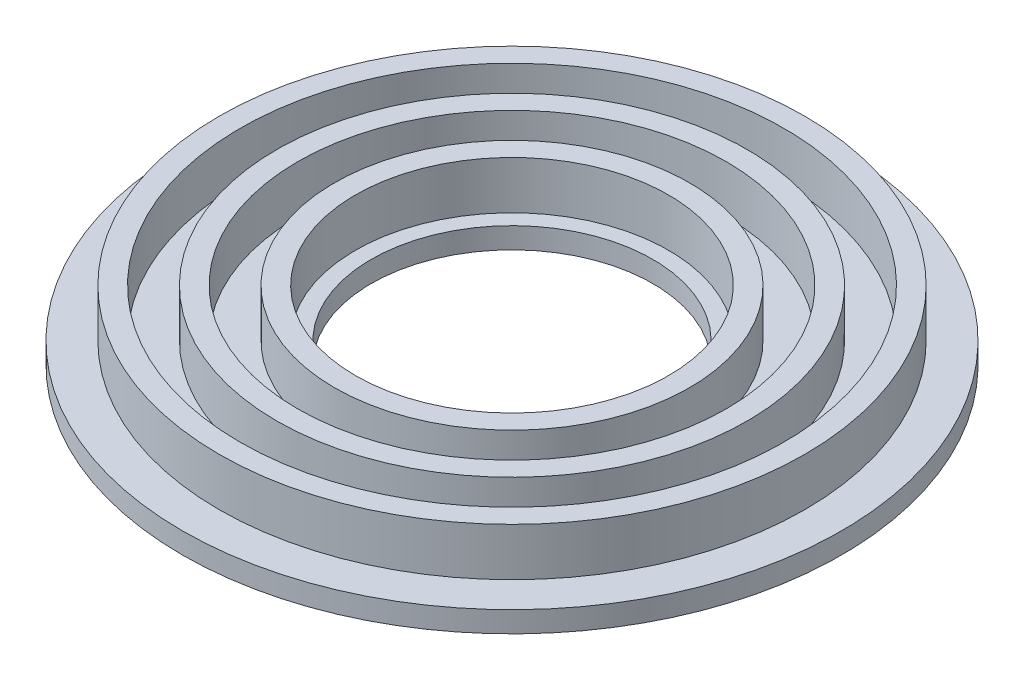
ISO-10303-21;
HEADER;
FILE_DESCRIPTION(('STEP AP214'),'2;1');
FILE_NAME('part.step','',(''),(''),'','','');
FILE_SCHEMA(('AUTOMOTIVE_DESIGN { 1 0 10303 214 1 1 1 1 }'));
ENDSEC;
DATA;
#1=APPLICATION_CONTEXT('core data for automotive mechanical design processes');
#2=APPLICATION_PROTOCOL_DEFINITION('international standard','automotive_design',2000,#1);
#3=PRODUCT_CONTEXT('',#1,'mechanical');
#4=PRODUCT('Part','Part','',(#3));
#5=PRODUCT_RELATED_PRODUCT_CATEGORY('part','',(#4));
#6=PRODUCT_DEFINITION_FORMATION('','',#4);
#7=PRODUCT_DEFINITION_CONTEXT('part definition',#1,'design');
#8=PRODUCT_DEFINITION('design','',#6,#7);
#9=PRODUCT_DEFINITION_SHAPE('','',#8);
#10=(LENGTH_UNIT() NAMED_UNIT(*) SI_UNIT(.MILLI.,.METRE.));
#11=(NAMED_UNIT(*) PLANE_ANGLE_UNIT() SI_UNIT($,.RADIAN.));
#12=(NAMED_UNIT(*) SI_UNIT($,.STERADIAN.) SOLID_ANGLE_UNIT());
#13=UNCERTAINTY_MEASURE_WITH_UNIT(LENGTH_MEASURE(1.E-05),#10,'distance_accuracy_value','');
#14=(GEOMETRIC_REPRESENTATION_CONTEXT(3) GLOBAL_UNCERTAINTY_ASSIGNED_CONTEXT((#13)) GLOBAL_UNIT_ASSIGNED_CONTEXT((#10,
#11,#12)) REPRESENTATION_CONTEXT('',''));
#15=CARTESIAN_POINT('',(0.,0.,0.));
#16=DIRECTION('',(0.,0.,1.));
#17=DIRECTION('',(1.,0.,0.));
#18=AXIS2_PLACEMENT_3D('',#15,#16,#17);
#19=CARTESIAN_POINT('',(0.,0.7,0.));
#20=DIRECTION('',(0.,1.,0.));
#21=DIRECTION('',(0.,0.,1.));
#22=AXIS2_PLACEMENT_3D('',#19,#20,#21);
#23=PLANE('',#22);
#24=CARTESIAN_POINT('',(0.,0.7,0.));
#25=DIRECTION('',(0.,1.,0.));
#26=DIRECTION('',(0.,0.,1.));
#27=AXIS2_PLACEMENT_3D('',#24,#25,#26);
#28=CIRCLE('',#27,7.15);
#29=CARTESIAN_POINT('',(0.,0.7,7.15));
#30=VERTEX_POINT('',#29);
#31=EDGE_CURVE('E54',#30,#30,#28,.F.);
#32=ORIENTED_EDGE('',*,*,#31,.F.);
#33=EDGE_LOOP('',(#32));
#34=FACE_BOUND('',#33,.T.);
#35=CARTESIAN_POINT('',(0.,0.7,0.));
#36=DIRECTION('',(0.,1.,0.));
#37=DIRECTION('',(0.,0.,1.));
#38=AXIS2_PLACEMENT_3D('',#35,#36,#37);
#39=CIRCLE('',#38,5.925);
#40=CARTESIAN_POINT('',(0.,0.7,5.925));
#41=VERTEX_POINT('',#40);
#42=EDGE_CURVE('E89',#41,#41,#39,.T.);
#43=ORIENTED_EDGE('',*,*,#42,.F.);
#44=EDGE_LOOP('',(#43));
#45=FACE_BOUND('',#44,.T.);
#46=ADVANCED_FACE('F47',(#34,#45),#23,.T.);
#47=CARTESIAN_POINT('',(0.,0.7,0.));
#48=DIRECTION('',(0.,1.,0.));
#49=DIRECTION('',(0.,0.,1.));
#50=AXIS2_PLACEMENT_3D('',#47,#48,#49);
#51=CIRCLE('',#50,9.075);
#52=CARTESIAN_POINT('',(0.,0.7,9.075));
#53=VERTEX_POINT('',#52);
#54=EDGE_CURVE('E58',#53,#53,#51,.F.);
#55=ORIENTED_EDGE('',*,*,#54,.F.);
#56=EDGE_LOOP('',(#55));
#57=FACE_BOUND('',#56,.T.);
#58=CARTESIAN_POINT('',(0.,0.7,0.));
#59=DIRECTION('',(0.,1.,0.));
#60=DIRECTION('',(0.,0.,1.));
#61=AXIS2_PLACEMENT_3D('',#58,#59,#60);
#62=CIRCLE('',#61,7.85);
#63=CARTESIAN_POINT('',(0.,0.7,7.85));
#64=VERTEX_POINT('',#63);
#65=EDGE_CURVE('E80',#64,#64,#62,.T.);
#66=ORIENTED_EDGE('',*,*,#65,.F.);
#67=EDGE_LOOP('',(#66));
#68=FACE_BOUND('',#67,.T.);
#69=ADVANCED_FACE('F123',(#57,#68),#23,.T.);
#70=CARTESIAN_POINT('',(0.,0.7,0.));
#71=DIRECTION('',(0.,1.,0.));
#72=DIRECTION('',(0.,0.,1.));
#73=AXIS2_PLACEMENT_3D('',#70,#71,#72);
#74=CIRCLE('',#73,11.);
#75=CARTESIAN_POINT('',(0.,0.7,11.));
#76=VERTEX_POINT('',#75);
#77=EDGE_CURVE('E62',#76,#76,#74,.T.);
#78=ORIENTED_EDGE('',*,*,#77,.T.);
#79=EDGE_LOOP('',(#78));
#80=FACE_BOUND('',#79,.T.);
#81=CARTESIAN_POINT('',(0.,0.7,0.));
#82=DIRECTION('',(0.,1.,0.));
#83=DIRECTION('',(0.,0.,1.));
#84=AXIS2_PLACEMENT_3D('',#81,#82,#83);
#85=CIRCLE('',#84,9.775);
#86=CARTESIAN_POINT('',(0.,0.7,9.775));
#87=VERTEX_POINT('',#86);
#88=EDGE_CURVE('E71',#87,#87,#85,.T.);
#89=ORIENTED_EDGE('',*,*,#88,.F.);
#90=EDGE_LOOP('',(#89));
#91=FACE_BOUND('',#90,.T.);
#92=ADVANCED_FACE('F112',(#80,#91),#23,.T.);
#93=CARTESIAN_POINT('',(0.,0.7,0.));
#94=DIRECTION('',(0.,-1.,0.));
#95=DIRECTION('',(0.,0.,-1.));
#96=AXIS2_PLACEMENT_3D('',#93,#94,#95);
#97=CYLINDRICAL_SURFACE('',#96,11.);
#98=ORIENTED_EDGE('',*,*,#77,.F.);
#99=EDGE_LOOP('',(#98));
#100=FACE_BOUND('',#99,.T.);
#101=CARTESIAN_POINT('',(0.,0.,0.));
#102=DIRECTION('',(0.,1.,0.));
#103=DIRECTION('',(0.,0.,1.));
#104=AXIS2_PLACEMENT_3D('',#101,#102,#103);
#105=CIRCLE('',#104,11.);
#106=CARTESIAN_POINT('',(0.,0.,11.));
#107=VERTEX_POINT('',#106);
#108=EDGE_CURVE('E65',#107,#107,#105,.T.);
#109=ORIENTED_EDGE('',*,*,#108,.T.);
#110=EDGE_LOOP('',(#109));
#111=FACE_BOUND('',#110,.T.);
#112=ADVANCED_FACE('F49',(#100,#111),#97,.T.);
#113=CARTESIAN_POINT('',(0.,0.,0.));
#114=DIRECTION('',(0.,1.,0.));
#115=DIRECTION('',(0.,0.,1.));
#116=AXIS2_PLACEMENT_3D('',#113,#114,#115);
#117=PLANE('',#116);
#118=CARTESIAN_POINT('',(0.,0.,0.));
#119=DIRECTION('',(0.,1.,0.));
#120=DIRECTION('',(0.,0.,1.));
#121=AXIS2_PLACEMENT_3D('',#118,#119,#120);
#122=CIRCLE('',#121,4.7);
#123=CARTESIAN_POINT('',(0.,0.,4.7));
#124=VERTEX_POINT('',#123);
#125=EDGE_CURVE('E93',#124,#124,#122,.T.);
#126=ORIENTED_EDGE('',*,*,#125,.T.);
#127=EDGE_LOOP('',(#126));
#128=FACE_BOUND('',#127,.T.);
#129=ORIENTED_EDGE('',*,*,#108,.F.);
#130=EDGE_LOOP('',(#129));
#131=FACE_BOUND('',#130,.T.);
#132=ADVANCED_FACE('F131',(#128,#131),#117,.F.);
#133=CARTESIAN_POINT('',(0.,2.3,0.));
#134=DIRECTION('',(0.,-1.,0.));
#135=DIRECTION('',(0.,0.,-1.));
#136=AXIS2_PLACEMENT_3D('',#133,#134,#135);
#137=CYLINDRICAL_SURFACE('',#136,9.075);
#138=CARTESIAN_POINT('',(0.,2.3,0.));
#139=DIRECTION('',(0.,1.,0.));
#140=DIRECTION('',(0.,0.,1.));
#141=AXIS2_PLACEMENT_3D('',#138,#139,#140);
#142=CIRCLE('',#141,9.075);
#143=CARTESIAN_POINT('',(0.,2.3,9.075));
#144=VERTEX_POINT('',#143);
#145=EDGE_CURVE('E74',#144,#144,#142,.T.);
#146=ORIENTED_EDGE('',*,*,#145,.T.);
#147=EDGE_LOOP('',(#146));
#148=FACE_BOUND('',#147,.T.);
#149=ORIENTED_EDGE('',*,*,#54,.T.);
#150=EDGE_LOOP('',(#149));
#151=FACE_BOUND('',#150,.T.);
#152=ADVANCED_FACE('F141',(#148,#151),#137,.F.);
#153=CARTESIAN_POINT('',(0.,2.3,0.));
#154=DIRECTION('',(0.,-1.,0.));
#155=DIRECTION('',(0.,0.,-1.));
#156=AXIS2_PLACEMENT_3D('',#153,#154,#155);
#157=CYLINDRICAL_SURFACE('',#156,9.775);
#158=CARTESIAN_POINT('',(0.,2.3,0.));
#159=DIRECTION('',(0.,1.,0.));
#160=DIRECTION('',(0.,0.,1.));
#161=AXIS2_PLACEMENT_3D('',#158,#159,#160);
#162=CIRCLE('',#161,9.775);
#163=CARTESIAN_POINT('',(0.,2.3,9.775));
#164=VERTEX_POINT('',#163);
#165=EDGE_CURVE('E68',#164,#164,#162,.T.);
#166=ORIENTED_EDGE('',*,*,#165,.F.);
#167=EDGE_LOOP('',(#166));
#168=FACE_BOUND('',#167,.T.);
#169=ORIENTED_EDGE('',*,*,#88,.T.);
#170=EDGE_LOOP('',(#169));
#171=FACE_BOUND('',#170,.T.);
#172=ADVANCED_FACE('F138',(#168,#171),#157,.T.);
#173=CARTESIAN_POINT('',(-24.3414213562373,2.3,0.));
#174=DIRECTION('',(0.,1.,0.));
#175=DIRECTION('',(0.,0.,1.));
#176=AXIS2_PLACEMENT_3D('',#173,#174,#175);
#177=PLANE('',#176);
#178=ORIENTED_EDGE('',*,*,#145,.F.);
#179=EDGE_LOOP('',(#178));
#180=FACE_BOUND('',#179,.T.);
#181=ORIENTED_EDGE('',*,*,#165,.T.);
#182=EDGE_LOOP('',(#181));
#183=FACE_BOUND('',#182,.T.);
#184=ADVANCED_FACE('F140',(#180,#183),#177,.T.);
#185=CARTESIAN_POINT('',(0.,2.3,0.));
#186=DIRECTION('',(0.,-1.,0.));
#187=DIRECTION('',(0.,0.,-1.));
#188=AXIS2_PLACEMENT_3D('',#185,#186,#187);
#189=CYLINDRICAL_SURFACE('',#188,7.15);
#190=CARTESIAN_POINT('',(0.,2.3,0.));
#191=DIRECTION('',(0.,1.,0.));
#192=DIRECTION('',(0.,0.,1.));
#193=AXIS2_PLACEMENT_3D('',#190,#191,#192);
#194=CIRCLE('',#193,7.15);
#195=CARTESIAN_POINT('',(0.,2.3,7.15));
#196=VERTEX_POINT('',#195);
#197=EDGE_CURVE('E83',#196,#196,#194,.T.);
#198=ORIENTED_EDGE('',*,*,#197,.T.);
#199=EDGE_LOOP('',(#198));
#200=FACE_BOUND('',#199,.T.);
#201=ORIENTED_EDGE('',*,*,#31,.T.);
#202=EDGE_LOOP('',(#201));
#203=FACE_BOUND('',#202,.T.);
#204=ADVANCED_FACE('F148',(#200,#203),#189,.F.);
#205=CARTESIAN_POINT('',(0.,2.3,0.));
#206=DIRECTION('',(0.,-1.,0.));
#207=DIRECTION('',(0.,0.,-1.));
#208=AXIS2_PLACEMENT_3D('',#205,#206,#207);
#209=CYLINDRICAL_SURFACE('',#208,7.85);
#210=CARTESIAN_POINT('',(0.,2.3,0.));
#211=DIRECTION('',(0.,1.,0.));
#212=DIRECTION('',(0.,0.,1.));
#213=AXIS2_PLACEMENT_3D('',#210,#211,#212);
#214=CIRCLE('',#213,7.85);
#215=CARTESIAN_POINT('',(0.,2.3,7.85));
#216=VERTEX_POINT('',#215);
#217=EDGE_CURVE('E75',#216,#216,#214,.T.);
#218=ORIENTED_EDGE('',*,*,#217,.F.);
#219=EDGE_LOOP('',(#218));
#220=FACE_BOUND('',#219,.T.);
#221=ORIENTED_EDGE('',*,*,#65,.T.);
#222=EDGE_LOOP('',(#221));
#223=FACE_BOUND('',#222,.T.);
#224=ADVANCED_FACE('F156',(#220,#223),#209,.T.);
#225=CARTESIAN_POINT('',(-24.3414213562373,2.3,0.));
#226=DIRECTION('',(0.,1.,0.));
#227=DIRECTION('',(0.,0.,1.));
#228=AXIS2_PLACEMENT_3D('',#225,#226,#227);
#229=PLANE('',#228);
#230=ORIENTED_EDGE('',*,*,#197,.F.);
#231=EDGE_LOOP('',(#230));
#232=FACE_BOUND('',#231,.T.);
#233=ORIENTED_EDGE('',*,*,#217,.T.);
#234=EDGE_LOOP('',(#233));
#235=FACE_BOUND('',#234,.T.);
#236=ADVANCED_FACE('F160',(#232,#235),#229,.T.);
#237=CARTESIAN_POINT('',(0.,2.3,0.));
#238=DIRECTION('',(0.,-1.,0.));
#239=DIRECTION('',(0.,0.,-1.));
#240=AXIS2_PLACEMENT_3D('',#237,#238,#239);
#241=CYLINDRICAL_SURFACE('',#240,5.225);
#242=CARTESIAN_POINT('',(0.,2.3,0.));
#243=DIRECTION('',(0.,1.,0.));
#244=DIRECTION('',(0.,0.,1.));
#245=AXIS2_PLACEMENT_3D('',#242,#243,#244);
#246=CIRCLE('',#245,5.225);
#247=CARTESIAN_POINT('',(0.,2.3,5.225));
#248=VERTEX_POINT('',#247);
#249=EDGE_CURVE('E92',#248,#248,#246,.T.);
#250=ORIENTED_EDGE('',*,*,#249,.T.);
#251=EDGE_LOOP('',(#250));
#252=FACE_BOUND('',#251,.T.);
#253=CARTESIAN_POINT('',(0.,0.7,0.));
#254=DIRECTION('',(0.,1.,0.));
#255=DIRECTION('',(0.,0.,1.));
#256=AXIS2_PLACEMENT_3D('',#253,#254,#255);
#257=CIRCLE('',#256,5.225);
#258=CARTESIAN_POINT('',(0.,0.7,5.225));
#259=VERTEX_POINT('',#258);
#260=EDGE_CURVE('E11',#259,#259,#257,.F.);
#261=ORIENTED_EDGE('',*,*,#260,.T.);
#262=EDGE_LOOP('',(#261));
#263=FACE_BOUND('',#262,.T.);
#264=ADVANCED_FACE('F164',(#252,#263),#241,.F.);
#265=CARTESIAN_POINT('',(0.,2.3,0.));
#266=DIRECTION('',(0.,-1.,0.));
#267=DIRECTION('',(0.,0.,-1.));
#268=AXIS2_PLACEMENT_3D('',#265,#266,#267);
#269=CYLINDRICAL_SURFACE('',#268,5.925);
#270=CARTESIAN_POINT('',(0.,2.3,0.));
#271=DIRECTION('',(0.,1.,0.));
#272=DIRECTION('',(0.,0.,1.));
#273=AXIS2_PLACEMENT_3D('',#270,#271,#272);
#274=CIRCLE('',#273,5.925);
#275=CARTESIAN_POINT('',(0.,2.3,5.925));
#276=VERTEX_POINT('',#275);
#277=EDGE_CURVE('E84',#276,#276,#274,.T.);
#278=ORIENTED_EDGE('',*,*,#277,.F.);
#279=EDGE_LOOP('',(#278));
#280=FACE_BOUND('',#279,.T.);
#281=ORIENTED_EDGE('',*,*,#42,.T.);
#282=EDGE_LOOP('',(#281));
#283=FACE_BOUND('',#282,.T.);
#284=ADVANCED_FACE('F118',(#280,#283),#269,.T.);
#285=CARTESIAN_POINT('',(-24.3414213562373,2.3,0.));
#286=DIRECTION('',(0.,1.,0.));
#287=DIRECTION('',(0.,0.,1.));
#288=AXIS2_PLACEMENT_3D('',#285,#286,#287);
#289=PLANE('',#288);
#290=ORIENTED_EDGE('',*,*,#249,.F.);
#291=EDGE_LOOP('',(#290));
#292=FACE_BOUND('',#291,.T.);
#293=ORIENTED_EDGE('',*,*,#277,.T.);
#294=EDGE_LOOP('',(#293));
#295=FACE_BOUND('',#294,.T.);
#296=ADVANCED_FACE('F110',(#292,#295),#289,.T.);
#297=CARTESIAN_POINT('',(0.,0.7,0.));
#298=DIRECTION('',(0.,1.,0.));
#299=DIRECTION('',(0.,0.,1.));
#300=AXIS2_PLACEMENT_3D('',#297,#298,#299);
#301=CIRCLE('',#300,4.7);
#302=CARTESIAN_POINT('',(0.,0.7,4.7));
#303=VERTEX_POINT('',#302);
#304=EDGE_CURVE('E100',#303,#303,#301,.T.);
#305=ORIENTED_EDGE('',*,*,#304,.F.);
#306=EDGE_LOOP('',(#305));
#307=FACE_BOUND('',#306,.T.);
#308=ORIENTED_EDGE('',*,*,#260,.F.);
#309=EDGE_LOOP('',(#308));
#310=FACE_BOUND('',#309,.T.);
#311=ADVANCED_FACE('F107',(#307,#310),#23,.T.);
#312=CARTESIAN_POINT('',(0.,-0.9,0.));
#313=DIRECTION('',(0.,1.,0.));
#314=DIRECTION('',(0.,0.,1.));
#315=AXIS2_PLACEMENT_3D('',#312,#313,#314);
#316=CYLINDRICAL_SURFACE('',#315,4.7);
#317=ORIENTED_EDGE('',*,*,#304,.T.);
#318=EDGE_LOOP('',(#317));
#319=FACE_BOUND('',#318,.T.);
#320=ORIENTED_EDGE('',*,*,#125,.F.);
#321=EDGE_LOOP('',(#320));
#322=FACE_BOUND('',#321,.T.);
#323=ADVANCED_FACE('F104',(#319,#322),#316,.F.);
#324=CLOSED_SHELL('',(#46,#69,#92,#112,#132,#152,#172,#184,#204,#224,#236,#264,#284,#296,#311,#323));
#325=MANIFOLD_SOLID_BREP('B2',#324);
#326=ADVANCED_BREP_SHAPE_REPRESENTATION('',(#18,#325),#14);
#327=SHAPE_DEFINITION_REPRESENTATION(#9,#326);
ENDSEC;
END-ISO-10303-21;
